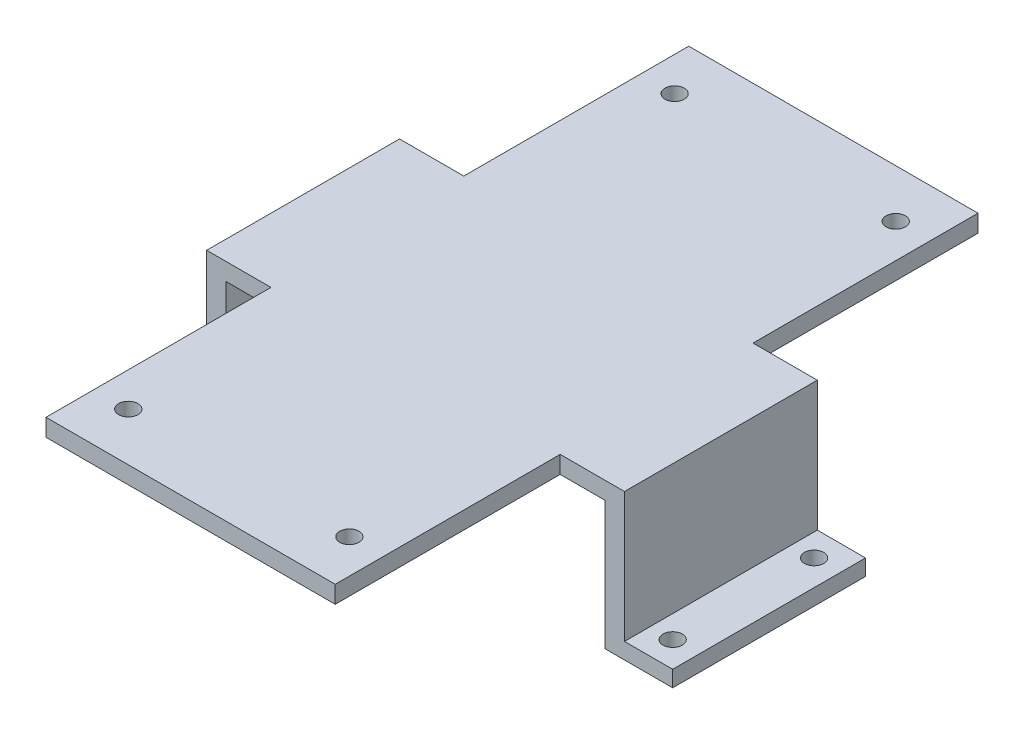
ISO-10303-21;
HEADER;
FILE_DESCRIPTION(('STEP AP214'),'2;1');
FILE_NAME('part.step','',(''),(''),'','','');
FILE_SCHEMA(('AUTOMOTIVE_DESIGN { 1 0 10303 214 1 1 1 1 }'));
ENDSEC;
DATA;
#1=APPLICATION_CONTEXT('core data for automotive mechanical design processes');
#2=APPLICATION_PROTOCOL_DEFINITION('international standard','automotive_design',2000,#1);
#3=PRODUCT_CONTEXT('',#1,'mechanical');
#4=PRODUCT('Part','Part','',(#3));
#5=PRODUCT_RELATED_PRODUCT_CATEGORY('part','',(#4));
#6=PRODUCT_DEFINITION_FORMATION('','',#4);
#7=PRODUCT_DEFINITION_CONTEXT('part definition',#1,'design');
#8=PRODUCT_DEFINITION('design','',#6,#7);
#9=PRODUCT_DEFINITION_SHAPE('','',#8);
#10=(LENGTH_UNIT() NAMED_UNIT(*) SI_UNIT(.MILLI.,.METRE.));
#11=(NAMED_UNIT(*) PLANE_ANGLE_UNIT() SI_UNIT($,.RADIAN.));
#12=(NAMED_UNIT(*) SI_UNIT($,.STERADIAN.) SOLID_ANGLE_UNIT());
#13=UNCERTAINTY_MEASURE_WITH_UNIT(LENGTH_MEASURE(1.E-05),#10,'distance_accuracy_value','');
#14=(GEOMETRIC_REPRESENTATION_CONTEXT(3) GLOBAL_UNCERTAINTY_ASSIGNED_CONTEXT((#13)) GLOBAL_UNIT_ASSIGNED_CONTEXT((#10,
#11,#12)) REPRESENTATION_CONTEXT('',''));
#15=CARTESIAN_POINT('',(0.,0.,0.));
#16=DIRECTION('',(0.,0.,1.));
#17=DIRECTION('',(1.,0.,0.));
#18=AXIS2_PLACEMENT_3D('',#15,#16,#17);
#19=CARTESIAN_POINT('',(-55.,0.,0.));
#20=DIRECTION('',(-1.,0.,0.));
#21=DIRECTION('',(0.,0.,-1.));
#22=AXIS2_PLACEMENT_3D('',#19,#20,#21);
#23=PLANE('',#22);
#24=DIRECTION('',(0.,1.,0.));
#25=VECTOR('',#24,1.);
#26=CARTESIAN_POINT('',(-55.,2.70166894999229,-65.));
#27=LINE('',#26,#25);
#28=CARTESIAN_POINT('',(-55.,-17.5,-65.));
#29=VERTEX_POINT('',#28);
#30=CARTESIAN_POINT('',(-55.,2.70166894999229,-65.));
#31=VERTEX_POINT('',#30);
#32=EDGE_CURVE('E224',#29,#31,#27,.T.);
#33=ORIENTED_EDGE('',*,*,#32,.F.);
#34=DIRECTION('',(0.,0.,1.));
#35=VECTOR('',#34,1.);
#36=CARTESIAN_POINT('',(-55.,-17.5,-65.));
#37=LINE('',#36,#35);
#38=CARTESIAN_POINT('',(-55.,-17.5,-35.));
#39=VERTEX_POINT('',#38);
#40=EDGE_CURVE('E194',#29,#39,#37,.T.);
#41=ORIENTED_EDGE('',*,*,#40,.T.);
#42=DIRECTION('',(0.,-1.,0.));
#43=VECTOR('',#42,1.);
#44=CARTESIAN_POINT('',(-55.,2.70166894999229,-35.));
#45=LINE('',#44,#43);
#46=CARTESIAN_POINT('',(-55.,2.70166894999229,-35.));
#47=VERTEX_POINT('',#46);
#48=EDGE_CURVE('E189',#47,#39,#45,.T.);
#49=ORIENTED_EDGE('',*,*,#48,.F.);
#50=DIRECTION('',(0.,0.,1.));
#51=VECTOR('',#50,1.);
#52=CARTESIAN_POINT('',(-55.,2.70166894999229,-35.));
#53=LINE('',#52,#51);
#54=EDGE_CURVE('E220',#31,#47,#53,.T.);
#55=ORIENTED_EDGE('',*,*,#54,.F.);
#56=EDGE_LOOP('',(#33,#41,#49,#55));
#57=FACE_BOUND('',#56,.T.);
#58=ADVANCED_FACE('F35',(#57),#23,.T.);
#59=CARTESIAN_POINT('',(0.,0.,0.));
#60=DIRECTION('',(0.,1.,0.));
#61=DIRECTION('',(0.,0.,1.));
#62=AXIS2_PLACEMENT_3D('',#59,#60,#61);
#63=PLANE('',#62);
#64=CARTESIAN_POINT('',(-39.7,0.,-7.49999999999999));
#65=DIRECTION('',(0.,1.,0.));
#66=DIRECTION('',(0.,0.,1.));
#67=AXIS2_PLACEMENT_3D('',#64,#65,#66);
#68=CIRCLE('',#67,1.5);
#69=CARTESIAN_POINT('',(-39.7,0.,-5.99999999999999));
#70=VERTEX_POINT('',#69);
#71=EDGE_CURVE('E293',#70,#70,#68,.F.);
#72=ORIENTED_EDGE('',*,*,#71,.F.);
#73=EDGE_LOOP('',(#72));
#74=FACE_BOUND('',#73,.T.);
#75=CARTESIAN_POINT('',(-39.7,0.,-92.5));
#76=DIRECTION('',(0.,1.,0.));
#77=DIRECTION('',(0.,0.,1.));
#78=AXIS2_PLACEMENT_3D('',#75,#76,#77);
#79=CIRCLE('',#78,1.5);
#80=CARTESIAN_POINT('',(-39.7,0.,-91.));
#81=VERTEX_POINT('',#80);
#82=EDGE_CURVE('E302',#81,#81,#79,.F.);
#83=ORIENTED_EDGE('',*,*,#82,.F.);
#84=EDGE_LOOP('',(#83));
#85=FACE_BOUND('',#84,.T.);
#86=CARTESIAN_POINT('',(-5.3,0.,-92.5));
#87=DIRECTION('',(0.,1.,0.));
#88=DIRECTION('',(0.,0.,1.));
#89=AXIS2_PLACEMENT_3D('',#86,#87,#88);
#90=CIRCLE('',#89,1.5);
#91=CARTESIAN_POINT('',(-5.3,0.,-91.));
#92=VERTEX_POINT('',#91);
#93=EDGE_CURVE('E341',#92,#92,#90,.F.);
#94=ORIENTED_EDGE('',*,*,#93,.F.);
#95=EDGE_LOOP('',(#94));
#96=FACE_BOUND('',#95,.T.);
#97=CARTESIAN_POINT('',(-5.3,0.,-7.49999999999998));
#98=DIRECTION('',(0.,1.,0.));
#99=DIRECTION('',(0.,0.,1.));
#100=AXIS2_PLACEMENT_3D('',#97,#98,#99);
#101=CIRCLE('',#100,1.5);
#102=CARTESIAN_POINT('',(-5.3,0.,-5.99999999999998));
#103=VERTEX_POINT('',#102);
#104=EDGE_CURVE('E43',#103,#103,#101,.F.);
#105=ORIENTED_EDGE('',*,*,#104,.F.);
#106=EDGE_LOOP('',(#105));
#107=FACE_BOUND('',#106,.T.);
#108=DIRECTION('',(0.,0.,1.));
#109=VECTOR('',#108,1.);
#110=CARTESIAN_POINT('',(-52.,0.,-35.));
#111=LINE('',#110,#109);
#112=CARTESIAN_POINT('',(-52.,0.,-65.));
#113=VERTEX_POINT('',#112);
#114=CARTESIAN_POINT('',(-52.,0.,-35.));
#115=VERTEX_POINT('',#114);
#116=EDGE_CURVE('E203',#113,#115,#111,.T.);
#117=ORIENTED_EDGE('',*,*,#116,.F.);
#118=DIRECTION('',(1.,0.,0.));
#119=VECTOR('',#118,1.);
#120=CARTESIAN_POINT('',(-55.,0.,-65.));
#121=LINE('',#120,#119);
#122=CARTESIAN_POINT('',(-45.,0.,-65.));
#123=VERTEX_POINT('',#122);
#124=EDGE_CURVE('E231',#113,#123,#121,.T.);
#125=ORIENTED_EDGE('',*,*,#124,.T.);
#126=DIRECTION('',(0.,0.,1.));
#127=VECTOR('',#126,1.);
#128=CARTESIAN_POINT('',(-45.,0.,0.));
#129=LINE('',#128,#127);
#130=CARTESIAN_POINT('',(-45.,0.,-100.));
#131=VERTEX_POINT('',#130);
#132=EDGE_CURVE('E325',#131,#123,#129,.T.);
#133=ORIENTED_EDGE('',*,*,#132,.F.);
#134=DIRECTION('',(-1.,0.,0.));
#135=VECTOR('',#134,1.);
#136=CARTESIAN_POINT('',(0.,0.,-100.));
#137=LINE('',#136,#135);
#138=CARTESIAN_POINT('',(0.,0.,-100.));
#139=VERTEX_POINT('',#138);
#140=EDGE_CURVE('E322',#139,#131,#137,.T.);
#141=ORIENTED_EDGE('',*,*,#140,.F.);
#142=DIRECTION('',(0.,0.,-1.));
#143=VECTOR('',#142,1.);
#144=CARTESIAN_POINT('',(0.,0.,0.));
#145=LINE('',#144,#143);
#146=CARTESIAN_POINT('',(0.,0.,-65.));
#147=VERTEX_POINT('',#146);
#148=EDGE_CURVE('E305',#147,#139,#145,.T.);
#149=ORIENTED_EDGE('',*,*,#148,.F.);
#150=DIRECTION('',(-1.,0.,0.));
#151=VECTOR('',#150,1.);
#152=CARTESIAN_POINT('',(10.,0.,-65.));
#153=LINE('',#152,#151);
#154=CARTESIAN_POINT('',(7.,0.,-65.));
#155=VERTEX_POINT('',#154);
#156=EDGE_CURVE('E289',#155,#147,#153,.T.);
#157=ORIENTED_EDGE('',*,*,#156,.F.);
#158=DIRECTION('',(0.,0.,-1.));
#159=VECTOR('',#158,1.);
#160=CARTESIAN_POINT('',(7.,0.,-35.));
#161=LINE('',#160,#159);
#162=CARTESIAN_POINT('',(7.,0.,-35.));
#163=VERTEX_POINT('',#162);
#164=EDGE_CURVE('E256',#163,#155,#161,.T.);
#165=ORIENTED_EDGE('',*,*,#164,.F.);
#166=DIRECTION('',(-1.,0.,0.));
#167=VECTOR('',#166,1.);
#168=CARTESIAN_POINT('',(10.,0.,-35.));
#169=LINE('',#168,#167);
#170=CARTESIAN_POINT('',(0.,0.,-35.));
#171=VERTEX_POINT('',#170);
#172=EDGE_CURVE('E291',#163,#171,#169,.T.);
#173=ORIENTED_EDGE('',*,*,#172,.T.);
#174=CARTESIAN_POINT('',(0.,0.,0.));
#175=VERTEX_POINT('',#174);
#176=EDGE_CURVE('E319',#175,#171,#145,.T.);
#177=ORIENTED_EDGE('',*,*,#176,.F.);
#178=DIRECTION('',(1.,0.,0.));
#179=VECTOR('',#178,1.);
#180=CARTESIAN_POINT('',(0.,0.,0.));
#181=LINE('',#180,#179);
#182=CARTESIAN_POINT('',(-45.,0.,0.));
#183=VERTEX_POINT('',#182);
#184=EDGE_CURVE('E328',#183,#175,#181,.T.);
#185=ORIENTED_EDGE('',*,*,#184,.F.);
#186=CARTESIAN_POINT('',(-45.,0.,-35.));
#187=VERTEX_POINT('',#186);
#188=EDGE_CURVE('E324',#187,#183,#129,.T.);
#189=ORIENTED_EDGE('',*,*,#188,.F.);
#190=DIRECTION('',(1.,0.,0.));
#191=VECTOR('',#190,1.);
#192=CARTESIAN_POINT('',(-55.,0.,-35.));
#193=LINE('',#192,#191);
#194=EDGE_CURVE('E58',#115,#187,#193,.T.);
#195=ORIENTED_EDGE('',*,*,#194,.F.);
#196=EDGE_LOOP('',(#117,#125,#133,#141,#149,#157,#165,#173,#177,#185,#189,#195));
#197=FACE_BOUND('',#196,.T.);
#198=ADVANCED_FACE('F351',(#74,#85,#96,#107,#197),#63,.F.);
#199=CARTESIAN_POINT('',(-45.,2.70166894999229,0.));
#200=DIRECTION('',(1.,0.,0.));
#201=DIRECTION('',(0.,0.,-1.));
#202=AXIS2_PLACEMENT_3D('',#199,#200,#201);
#203=PLANE('',#202);
#204=DIRECTION('',(0.,0.,1.));
#205=VECTOR('',#204,1.);
#206=CARTESIAN_POINT('',(-45.,2.70166894999229,0.));
#207=LINE('',#206,#205);
#208=CARTESIAN_POINT('',(-45.,2.70166894999229,-35.));
#209=VERTEX_POINT('',#208);
#210=CARTESIAN_POINT('',(-45.,2.70166894999229,0.));
#211=VERTEX_POINT('',#210);
#212=EDGE_CURVE('E312',#209,#211,#207,.T.);
#213=ORIENTED_EDGE('',*,*,#212,.F.);
#214=DIRECTION('',(0.,-1.,0.));
#215=VECTOR('',#214,1.);
#216=CARTESIAN_POINT('',(-45.,2.70166894999229,-35.));
#217=LINE('',#216,#215);
#218=EDGE_CURVE('E218',#209,#187,#217,.T.);
#219=ORIENTED_EDGE('',*,*,#218,.T.);
#220=ORIENTED_EDGE('',*,*,#188,.T.);
#221=DIRECTION('',(0.,-1.,0.));
#222=VECTOR('',#221,1.);
#223=CARTESIAN_POINT('',(-45.,2.70166894999229,0.));
#224=LINE('',#223,#222);
#225=EDGE_CURVE('E332',#211,#183,#224,.T.);
#226=ORIENTED_EDGE('',*,*,#225,.F.);
#227=EDGE_LOOP('',(#213,#219,#220,#226));
#228=FACE_BOUND('',#227,.T.);
#229=ADVANCED_FACE('F353',(#228),#203,.F.);
#230=CARTESIAN_POINT('',(0.,2.70166894999229,0.));
#231=DIRECTION('',(-1.,0.,0.));
#232=DIRECTION('',(0.,0.,1.));
#233=AXIS2_PLACEMENT_3D('',#230,#231,#232);
#234=PLANE('',#233);
#235=DIRECTION('',(0.,-1.,0.));
#236=VECTOR('',#235,1.);
#237=CARTESIAN_POINT('',(0.,2.70166894999229,-35.));
#238=LINE('',#237,#236);
#239=CARTESIAN_POINT('',(0.,2.70166894999229,-35.));
#240=VERTEX_POINT('',#239);
#241=EDGE_CURVE('E271',#240,#171,#238,.T.);
#242=ORIENTED_EDGE('',*,*,#241,.F.);
#243=DIRECTION('',(0.,0.,-1.));
#244=VECTOR('',#243,1.);
#245=CARTESIAN_POINT('',(0.,2.70166894999229,0.));
#246=LINE('',#245,#244);
#247=CARTESIAN_POINT('',(0.,2.70166894999229,0.));
#248=VERTEX_POINT('',#247);
#249=EDGE_CURVE('E306',#248,#240,#246,.T.);
#250=ORIENTED_EDGE('',*,*,#249,.F.);
#251=DIRECTION('',(0.,-1.,0.));
#252=VECTOR('',#251,1.);
#253=CARTESIAN_POINT('',(0.,2.70166894999229,0.));
#254=LINE('',#253,#252);
#255=EDGE_CURVE('E318',#248,#175,#254,.T.);
#256=ORIENTED_EDGE('',*,*,#255,.T.);
#257=ORIENTED_EDGE('',*,*,#176,.T.);
#258=EDGE_LOOP('',(#242,#250,#256,#257));
#259=FACE_BOUND('',#258,.T.);
#260=ADVANCED_FACE('F421',(#259),#234,.F.);
#261=DIRECTION('',(0.,1.,0.));
#262=VECTOR('',#261,1.);
#263=CARTESIAN_POINT('',(0.,2.70166894999229,-65.));
#264=LINE('',#263,#262);
#265=CARTESIAN_POINT('',(0.,2.70166894999229,-65.));
#266=VERTEX_POINT('',#265);
#267=EDGE_CURVE('E275',#147,#266,#264,.T.);
#268=ORIENTED_EDGE('',*,*,#267,.F.);
#269=ORIENTED_EDGE('',*,*,#148,.T.);
#270=DIRECTION('',(0.,-1.,0.));
#271=VECTOR('',#270,1.);
#272=CARTESIAN_POINT('',(0.,2.70166894999229,-100.));
#273=LINE('',#272,#271);
#274=CARTESIAN_POINT('',(0.,2.70166894999229,-100.));
#275=VERTEX_POINT('',#274);
#276=EDGE_CURVE('E338',#275,#139,#273,.T.);
#277=ORIENTED_EDGE('',*,*,#276,.F.);
#278=EDGE_CURVE('E310',#266,#275,#246,.T.);
#279=ORIENTED_EDGE('',*,*,#278,.F.);
#280=EDGE_LOOP('',(#268,#269,#277,#279));
#281=FACE_BOUND('',#280,.T.);
#282=ADVANCED_FACE('F387',(#281),#234,.F.);
#283=CARTESIAN_POINT('',(-5.3,-4.24264068711929,-7.49999999999998));
#284=DIRECTION('',(0.,1.,0.));
#285=DIRECTION('',(0.,0.,1.));
#286=AXIS2_PLACEMENT_3D('',#283,#284,#285);
#287=CYLINDRICAL_SURFACE('',#286,1.5);
#288=ORIENTED_EDGE('',*,*,#104,.T.);
#289=EDGE_LOOP('',(#288));
#290=FACE_BOUND('',#289,.T.);
#291=CARTESIAN_POINT('',(-5.3,2.70166894999229,-7.49999999999998));
#292=DIRECTION('',(0.,1.,0.));
#293=DIRECTION('',(0.,0.,1.));
#294=AXIS2_PLACEMENT_3D('',#291,#292,#293);
#295=CIRCLE('',#294,1.5);
#296=CARTESIAN_POINT('',(-5.3,2.70166894999229,-5.99999999999998));
#297=VERTEX_POINT('',#296);
#298=EDGE_CURVE('E11',#297,#297,#295,.T.);
#299=ORIENTED_EDGE('',*,*,#298,.T.);
#300=EDGE_LOOP('',(#299));
#301=FACE_BOUND('',#300,.T.);
#302=ADVANCED_FACE('F37',(#290,#301),#287,.F.);
#303=CARTESIAN_POINT('',(-5.3,-4.24264068711929,-92.5));
#304=DIRECTION('',(0.,1.,0.));
#305=DIRECTION('',(0.,0.,1.));
#306=AXIS2_PLACEMENT_3D('',#303,#304,#305);
#307=CYLINDRICAL_SURFACE('',#306,1.5);
#308=ORIENTED_EDGE('',*,*,#93,.T.);
#309=EDGE_LOOP('',(#308));
#310=FACE_BOUND('',#309,.T.);
#311=CARTESIAN_POINT('',(-5.3,2.70166894999229,-92.5));
#312=DIRECTION('',(0.,1.,0.));
#313=DIRECTION('',(0.,0.,1.));
#314=AXIS2_PLACEMENT_3D('',#311,#312,#313);
#315=CIRCLE('',#314,1.5);
#316=CARTESIAN_POINT('',(-5.3,2.70166894999229,-91.));
#317=VERTEX_POINT('',#316);
#318=EDGE_CURVE('E344',#317,#317,#315,.T.);
#319=ORIENTED_EDGE('',*,*,#318,.T.);
#320=EDGE_LOOP('',(#319));
#321=FACE_BOUND('',#320,.T.);
#322=ADVANCED_FACE('F707',(#310,#321),#307,.F.);
#323=CARTESIAN_POINT('',(0.,2.70166894999229,-100.));
#324=DIRECTION('',(0.,0.,1.));
#325=DIRECTION('',(1.,0.,0.));
#326=AXIS2_PLACEMENT_3D('',#323,#324,#325);
#327=PLANE('',#326);
#328=ORIENTED_EDGE('',*,*,#140,.T.);
#329=DIRECTION('',(0.,-1.,0.));
#330=VECTOR('',#329,1.);
#331=CARTESIAN_POINT('',(-45.,2.70166894999229,-100.));
#332=LINE('',#331,#330);
#333=CARTESIAN_POINT('',(-45.,2.70166894999229,-100.));
#334=VERTEX_POINT('',#333);
#335=EDGE_CURVE('E335',#334,#131,#332,.T.);
#336=ORIENTED_EDGE('',*,*,#335,.F.);
#337=DIRECTION('',(-1.,0.,0.));
#338=VECTOR('',#337,1.);
#339=CARTESIAN_POINT('',(0.,2.70166894999229,-100.));
#340=LINE('',#339,#338);
#341=EDGE_CURVE('E309',#275,#334,#340,.T.);
#342=ORIENTED_EDGE('',*,*,#341,.F.);
#343=ORIENTED_EDGE('',*,*,#276,.T.);
#344=EDGE_LOOP('',(#328,#336,#342,#343));
#345=FACE_BOUND('',#344,.T.);
#346=ADVANCED_FACE('F384',(#345),#327,.F.);
#347=ORIENTED_EDGE('',*,*,#132,.T.);
#348=DIRECTION('',(0.,1.,0.));
#349=VECTOR('',#348,1.);
#350=CARTESIAN_POINT('',(-45.,2.70166894999229,-65.));
#351=LINE('',#350,#349);
#352=CARTESIAN_POINT('',(-45.,2.70166894999229,-65.));
#353=VERTEX_POINT('',#352);
#354=EDGE_CURVE('E221',#123,#353,#351,.T.);
#355=ORIENTED_EDGE('',*,*,#354,.T.);
#356=EDGE_CURVE('E313',#334,#353,#207,.T.);
#357=ORIENTED_EDGE('',*,*,#356,.F.);
#358=ORIENTED_EDGE('',*,*,#335,.T.);
#359=EDGE_LOOP('',(#347,#355,#357,#358));
#360=FACE_BOUND('',#359,.T.);
#361=ADVANCED_FACE('F377',(#360),#203,.F.);
#362=CARTESIAN_POINT('',(0.,2.70166894999229,0.));
#363=DIRECTION('',(0.,0.,-1.));
#364=DIRECTION('',(-1.,0.,0.));
#365=AXIS2_PLACEMENT_3D('',#362,#363,#364);
#366=PLANE('',#365);
#367=ORIENTED_EDGE('',*,*,#184,.T.);
#368=ORIENTED_EDGE('',*,*,#255,.F.);
#369=DIRECTION('',(1.,0.,0.));
#370=VECTOR('',#369,1.);
#371=CARTESIAN_POINT('',(0.,2.70166894999229,0.));
#372=LINE('',#371,#370);
#373=EDGE_CURVE('E316',#211,#248,#372,.T.);
#374=ORIENTED_EDGE('',*,*,#373,.F.);
#375=ORIENTED_EDGE('',*,*,#225,.T.);
#376=EDGE_LOOP('',(#367,#368,#374,#375));
#377=FACE_BOUND('',#376,.T.);
#378=ADVANCED_FACE('F427',(#377),#366,.F.);
#379=CARTESIAN_POINT('',(0.,2.70166894999229,0.));
#380=DIRECTION('',(0.,1.,0.));
#381=DIRECTION('',(0.,0.,1.));
#382=AXIS2_PLACEMENT_3D('',#379,#380,#381);
#383=PLANE('',#382);
#384=CARTESIAN_POINT('',(-39.7,2.70166894999229,-7.49999999999999));
#385=DIRECTION('',(0.,1.,0.));
#386=DIRECTION('',(0.,0.,1.));
#387=AXIS2_PLACEMENT_3D('',#384,#385,#386);
#388=CIRCLE('',#387,1.5);
#389=CARTESIAN_POINT('',(-39.7,2.70166894999229,-5.99999999999999));
#390=VERTEX_POINT('',#389);
#391=EDGE_CURVE('E296',#390,#390,#388,.T.);
#392=ORIENTED_EDGE('',*,*,#391,.F.);
#393=EDGE_LOOP('',(#392));
#394=FACE_BOUND('',#393,.T.);
#395=CARTESIAN_POINT('',(-39.7,2.70166894999229,-92.5));
#396=DIRECTION('',(0.,1.,0.));
#397=DIRECTION('',(0.,0.,1.));
#398=AXIS2_PLACEMENT_3D('',#395,#396,#397);
#399=CIRCLE('',#398,1.5);
#400=CARTESIAN_POINT('',(-39.7,2.70166894999229,-91.));
#401=VERTEX_POINT('',#400);
#402=EDGE_CURVE('E299',#401,#401,#399,.T.);
#403=ORIENTED_EDGE('',*,*,#402,.F.);
#404=EDGE_LOOP('',(#403));
#405=FACE_BOUND('',#404,.T.);
#406=ORIENTED_EDGE('',*,*,#249,.T.);
#407=DIRECTION('',(-1.,0.,0.));
#408=VECTOR('',#407,1.);
#409=CARTESIAN_POINT('',(10.,2.70166894999229,-35.));
#410=LINE('',#409,#408);
#411=CARTESIAN_POINT('',(10.,2.70166894999229,-35.));
#412=VERTEX_POINT('',#411);
#413=EDGE_CURVE('E279',#412,#240,#410,.T.);
#414=ORIENTED_EDGE('',*,*,#413,.F.);
#415=DIRECTION('',(0.,0.,1.));
#416=VECTOR('',#415,1.);
#417=CARTESIAN_POINT('',(10.,2.70166894999229,-35.));
#418=LINE('',#417,#416);
#419=CARTESIAN_POINT('',(10.,2.70166894999229,-65.));
#420=VERTEX_POINT('',#419);
#421=EDGE_CURVE('E277',#420,#412,#418,.T.);
#422=ORIENTED_EDGE('',*,*,#421,.F.);
#423=DIRECTION('',(-1.,0.,0.));
#424=VECTOR('',#423,1.);
#425=CARTESIAN_POINT('',(10.,2.70166894999229,-65.));
#426=LINE('',#425,#424);
#427=EDGE_CURVE('E286',#420,#266,#426,.T.);
#428=ORIENTED_EDGE('',*,*,#427,.T.);
#429=ORIENTED_EDGE('',*,*,#278,.T.);
#430=ORIENTED_EDGE('',*,*,#341,.T.);
#431=ORIENTED_EDGE('',*,*,#356,.T.);
#432=DIRECTION('',(1.,0.,0.));
#433=VECTOR('',#432,1.);
#434=CARTESIAN_POINT('',(-55.,2.70166894999229,-65.));
#435=LINE('',#434,#433);
#436=EDGE_CURVE('E233',#31,#353,#435,.T.);
#437=ORIENTED_EDGE('',*,*,#436,.F.);
#438=ORIENTED_EDGE('',*,*,#54,.T.);
#439=DIRECTION('',(1.,0.,0.));
#440=VECTOR('',#439,1.);
#441=CARTESIAN_POINT('',(-55.,2.70166894999229,-35.));
#442=LINE('',#441,#440);
#443=EDGE_CURVE('E235',#47,#209,#442,.T.);
#444=ORIENTED_EDGE('',*,*,#443,.T.);
#445=ORIENTED_EDGE('',*,*,#212,.T.);
#446=ORIENTED_EDGE('',*,*,#373,.T.);
#447=EDGE_LOOP('',(#406,#414,#422,#428,#429,#430,#431,#437,#438,#444,#445,#446));
#448=FACE_BOUND('',#447,.T.);
#449=ORIENTED_EDGE('',*,*,#318,.F.);
#450=EDGE_LOOP('',(#449));
#451=FACE_BOUND('',#450,.T.);
#452=ORIENTED_EDGE('',*,*,#298,.F.);
#453=EDGE_LOOP('',(#452));
#454=FACE_BOUND('',#453,.T.);
#455=ADVANCED_FACE('F373',(#394,#405,#448,#451,#454),#383,.T.);
#456=CARTESIAN_POINT('',(-39.7,-4.24264068711929,-92.5));
#457=DIRECTION('',(0.,1.,0.));
#458=DIRECTION('',(0.,0.,1.));
#459=AXIS2_PLACEMENT_3D('',#456,#457,#458);
#460=CYLINDRICAL_SURFACE('',#459,1.5);
#461=ORIENTED_EDGE('',*,*,#82,.T.);
#462=EDGE_LOOP('',(#461));
#463=FACE_BOUND('',#462,.T.);
#464=ORIENTED_EDGE('',*,*,#402,.T.);
#465=EDGE_LOOP('',(#464));
#466=FACE_BOUND('',#465,.T.);
#467=ADVANCED_FACE('F469',(#463,#466),#460,.F.);
#468=CARTESIAN_POINT('',(-39.7,-4.24264068711929,-7.49999999999999));
#469=DIRECTION('',(0.,1.,0.));
#470=DIRECTION('',(0.,0.,1.));
#471=AXIS2_PLACEMENT_3D('',#468,#469,#470);
#472=CYLINDRICAL_SURFACE('',#471,1.5);
#473=ORIENTED_EDGE('',*,*,#71,.T.);
#474=EDGE_LOOP('',(#473));
#475=FACE_BOUND('',#474,.T.);
#476=ORIENTED_EDGE('',*,*,#391,.T.);
#477=EDGE_LOOP('',(#476));
#478=FACE_BOUND('',#477,.T.);
#479=ADVANCED_FACE('F466',(#475,#478),#472,.F.);
#480=CARTESIAN_POINT('',(10.,2.70166894999229,-35.));
#481=DIRECTION('',(0.,0.,-1.));
#482=DIRECTION('',(-1.,0.,0.));
#483=AXIS2_PLACEMENT_3D('',#480,#481,#482);
#484=PLANE('',#483);
#485=ORIENTED_EDGE('',*,*,#241,.T.);
#486=ORIENTED_EDGE('',*,*,#172,.F.);
#487=DIRECTION('',(0.,1.,0.));
#488=VECTOR('',#487,1.);
#489=CARTESIAN_POINT('',(7.,-20.,-35.));
#490=LINE('',#489,#488);
#491=CARTESIAN_POINT('',(7.,-20.,-35.));
#492=VERTEX_POINT('',#491);
#493=EDGE_CURVE('E268',#492,#163,#490,.T.);
#494=ORIENTED_EDGE('',*,*,#493,.F.);
#495=DIRECTION('',(-1.,0.,0.));
#496=VECTOR('',#495,1.);
#497=CARTESIAN_POINT('',(10.,-20.,-35.));
#498=LINE('',#497,#496);
#499=CARTESIAN_POINT('',(17.5,-20.,-35.));
#500=VERTEX_POINT('',#499);
#501=EDGE_CURVE('E257',#500,#492,#498,.T.);
#502=ORIENTED_EDGE('',*,*,#501,.F.);
#503=DIRECTION('',(0.,-1.,0.));
#504=VECTOR('',#503,1.);
#505=CARTESIAN_POINT('',(17.5,-20.,-35.));
#506=LINE('',#505,#504);
#507=CARTESIAN_POINT('',(17.5,-17.5,-35.));
#508=VERTEX_POINT('',#507);
#509=EDGE_CURVE('E238',#508,#500,#506,.T.);
#510=ORIENTED_EDGE('',*,*,#509,.F.);
#511=DIRECTION('',(-1.,0.,0.));
#512=VECTOR('',#511,1.);
#513=CARTESIAN_POINT('',(17.5,-17.5,-35.));
#514=LINE('',#513,#512);
#515=CARTESIAN_POINT('',(10.,-17.5,-35.));
#516=VERTEX_POINT('',#515);
#517=EDGE_CURVE('E248',#508,#516,#514,.T.);
#518=ORIENTED_EDGE('',*,*,#517,.T.);
#519=DIRECTION('',(0.,-1.,0.));
#520=VECTOR('',#519,1.);
#521=CARTESIAN_POINT('',(10.,2.70166894999229,-35.));
#522=LINE('',#521,#520);
#523=EDGE_CURVE('E272',#412,#516,#522,.T.);
#524=ORIENTED_EDGE('',*,*,#523,.F.);
#525=ORIENTED_EDGE('',*,*,#413,.T.);
#526=EDGE_LOOP('',(#485,#486,#494,#502,#510,#518,#524,#525));
#527=FACE_BOUND('',#526,.T.);
#528=ADVANCED_FACE('F418',(#527),#484,.F.);
#529=CARTESIAN_POINT('',(10.,2.70166894999229,-65.));
#530=DIRECTION('',(0.,0.,1.));
#531=DIRECTION('',(1.,0.,0.));
#532=AXIS2_PLACEMENT_3D('',#529,#530,#531);
#533=PLANE('',#532);
#534=ORIENTED_EDGE('',*,*,#267,.T.);
#535=ORIENTED_EDGE('',*,*,#427,.F.);
#536=DIRECTION('',(0.,1.,0.));
#537=VECTOR('',#536,1.);
#538=CARTESIAN_POINT('',(10.,2.70166894999229,-65.));
#539=LINE('',#538,#537);
#540=CARTESIAN_POINT('',(10.,-17.5,-65.));
#541=VERTEX_POINT('',#540);
#542=EDGE_CURVE('E274',#541,#420,#539,.T.);
#543=ORIENTED_EDGE('',*,*,#542,.F.);
#544=DIRECTION('',(-1.,0.,0.));
#545=VECTOR('',#544,1.);
#546=CARTESIAN_POINT('',(17.5,-17.5,-65.));
#547=LINE('',#546,#545);
#548=CARTESIAN_POINT('',(17.5,-17.5,-65.));
#549=VERTEX_POINT('',#548);
#550=EDGE_CURVE('E253',#549,#541,#547,.T.);
#551=ORIENTED_EDGE('',*,*,#550,.F.);
#552=DIRECTION('',(0.,1.,0.));
#553=VECTOR('',#552,1.);
#554=CARTESIAN_POINT('',(17.5,-20.,-65.));
#555=LINE('',#554,#553);
#556=CARTESIAN_POINT('',(17.5,-20.,-65.));
#557=VERTEX_POINT('',#556);
#558=EDGE_CURVE('E244',#557,#549,#555,.T.);
#559=ORIENTED_EDGE('',*,*,#558,.F.);
#560=DIRECTION('',(1.,0.,0.));
#561=VECTOR('',#560,1.);
#562=CARTESIAN_POINT('',(10.,-20.,-65.));
#563=LINE('',#562,#561);
#564=CARTESIAN_POINT('',(7.,-20.,-65.));
#565=VERTEX_POINT('',#564);
#566=EDGE_CURVE('E261',#565,#557,#563,.T.);
#567=ORIENTED_EDGE('',*,*,#566,.F.);
#568=DIRECTION('',(0.,1.,0.));
#569=VECTOR('',#568,1.);
#570=CARTESIAN_POINT('',(7.,-20.,-65.));
#571=LINE('',#570,#569);
#572=EDGE_CURVE('E263',#565,#155,#571,.T.);
#573=ORIENTED_EDGE('',*,*,#572,.T.);
#574=ORIENTED_EDGE('',*,*,#156,.T.);
#575=EDGE_LOOP('',(#534,#535,#543,#551,#559,#567,#573,#574));
#576=FACE_BOUND('',#575,.T.);
#577=ADVANCED_FACE('F390',(#576),#533,.F.);
#578=CARTESIAN_POINT('',(10.,0.,0.));
#579=DIRECTION('',(1.,0.,0.));
#580=DIRECTION('',(0.,0.,-1.));
#581=AXIS2_PLACEMENT_3D('',#578,#579,#580);
#582=PLANE('',#581);
#583=DIRECTION('',(0.,0.,1.));
#584=VECTOR('',#583,1.);
#585=CARTESIAN_POINT('',(10.,-17.5,-35.));
#586=LINE('',#585,#584);
#587=EDGE_CURVE('E237',#541,#516,#586,.T.);
#588=ORIENTED_EDGE('',*,*,#587,.F.);
#589=ORIENTED_EDGE('',*,*,#542,.T.);
#590=ORIENTED_EDGE('',*,*,#421,.T.);
#591=ORIENTED_EDGE('',*,*,#523,.T.);
#592=EDGE_LOOP('',(#588,#589,#590,#591));
#593=FACE_BOUND('',#592,.T.);
#594=ADVANCED_FACE('F396',(#593),#582,.T.);
#595=CARTESIAN_POINT('',(7.,-20.,-35.));
#596=DIRECTION('',(1.,0.,0.));
#597=DIRECTION('',(0.,0.,-1.));
#598=AXIS2_PLACEMENT_3D('',#595,#596,#597);
#599=PLANE('',#598);
#600=ORIENTED_EDGE('',*,*,#164,.T.);
#601=ORIENTED_EDGE('',*,*,#572,.F.);
#602=DIRECTION('',(0.,0.,-1.));
#603=VECTOR('',#602,1.);
#604=CARTESIAN_POINT('',(7.,-20.,-35.));
#605=LINE('',#604,#603);
#606=EDGE_CURVE('E259',#492,#565,#605,.T.);
#607=ORIENTED_EDGE('',*,*,#606,.F.);
#608=ORIENTED_EDGE('',*,*,#493,.T.);
#609=EDGE_LOOP('',(#600,#601,#607,#608));
#610=FACE_BOUND('',#609,.T.);
#611=ADVANCED_FACE('F414',(#610),#599,.F.);
#612=CARTESIAN_POINT('',(0.,-20.,0.));
#613=DIRECTION('',(0.,1.,0.));
#614=DIRECTION('',(0.,0.,1.));
#615=AXIS2_PLACEMENT_3D('',#612,#613,#614);
#616=PLANE('',#615);
#617=CARTESIAN_POINT('',(13.5,-20.,-61.));
#618=DIRECTION('',(0.,-1.,0.));
#619=DIRECTION('',(0.,0.,-1.));
#620=AXIS2_PLACEMENT_3D('',#617,#618,#619);
#621=CIRCLE('',#620,1.5);
#622=CARTESIAN_POINT('',(13.5,-20.,-62.5));
#623=VERTEX_POINT('',#622);
#624=EDGE_CURVE('E744',#623,#623,#621,.F.);
#625=ORIENTED_EDGE('',*,*,#624,.T.);
#626=EDGE_LOOP('',(#625));
#627=FACE_BOUND('',#626,.T.);
#628=CARTESIAN_POINT('',(13.5,-20.,-39.));
#629=DIRECTION('',(0.,-1.,0.));
#630=DIRECTION('',(0.,0.,-1.));
#631=AXIS2_PLACEMENT_3D('',#628,#629,#630);
#632=CIRCLE('',#631,1.5);
#633=CARTESIAN_POINT('',(13.5,-20.,-40.5));
#634=VERTEX_POINT('',#633);
#635=EDGE_CURVE('E754',#634,#634,#632,.F.);
#636=ORIENTED_EDGE('',*,*,#635,.T.);
#637=EDGE_LOOP('',(#636));
#638=FACE_BOUND('',#637,.T.);
#639=ORIENTED_EDGE('',*,*,#566,.T.);
#640=DIRECTION('',(0.,0.,-1.));
#641=VECTOR('',#640,1.);
#642=CARTESIAN_POINT('',(17.5,-20.,-35.));
#643=LINE('',#642,#641);
#644=EDGE_CURVE('E241',#500,#557,#643,.T.);
#645=ORIENTED_EDGE('',*,*,#644,.F.);
#646=ORIENTED_EDGE('',*,*,#501,.T.);
#647=ORIENTED_EDGE('',*,*,#606,.T.);
#648=EDGE_LOOP('',(#639,#645,#646,#647));
#649=FACE_BOUND('',#648,.T.);
#650=ADVANCED_FACE('F410',(#627,#638,#649),#616,.F.);
#651=CARTESIAN_POINT('',(17.5,-17.5,-35.));
#652=DIRECTION('',(0.,-1.,0.));
#653=DIRECTION('',(0.,0.,-1.));
#654=AXIS2_PLACEMENT_3D('',#651,#652,#653);
#655=PLANE('',#654);
#656=CARTESIAN_POINT('',(13.5,-17.5,-61.));
#657=DIRECTION('',(0.,1.,0.));
#658=DIRECTION('',(0.,0.,1.));
#659=AXIS2_PLACEMENT_3D('',#656,#657,#658);
#660=CIRCLE('',#659,1.5);
#661=CARTESIAN_POINT('',(13.5,-17.5,-59.5));
#662=VERTEX_POINT('',#661);
#663=EDGE_CURVE('E741',#662,#662,#660,.T.);
#664=ORIENTED_EDGE('',*,*,#663,.F.);
#665=EDGE_LOOP('',(#664));
#666=FACE_BOUND('',#665,.T.);
#667=CARTESIAN_POINT('',(13.5,-17.5,-39.));
#668=DIRECTION('',(0.,1.,0.));
#669=DIRECTION('',(0.,0.,1.));
#670=AXIS2_PLACEMENT_3D('',#667,#668,#669);
#671=CIRCLE('',#670,1.5);
#672=CARTESIAN_POINT('',(13.5,-17.5,-37.5));
#673=VERTEX_POINT('',#672);
#674=EDGE_CURVE('E757',#673,#673,#671,.T.);
#675=ORIENTED_EDGE('',*,*,#674,.F.);
#676=EDGE_LOOP('',(#675));
#677=FACE_BOUND('',#676,.T.);
#678=ORIENTED_EDGE('',*,*,#587,.T.);
#679=ORIENTED_EDGE('',*,*,#517,.F.);
#680=DIRECTION('',(0.,0.,1.));
#681=VECTOR('',#680,1.);
#682=CARTESIAN_POINT('',(17.5,-17.5,-35.));
#683=LINE('',#682,#681);
#684=EDGE_CURVE('E246',#549,#508,#683,.T.);
#685=ORIENTED_EDGE('',*,*,#684,.F.);
#686=ORIENTED_EDGE('',*,*,#550,.T.);
#687=EDGE_LOOP('',(#678,#679,#685,#686));
#688=FACE_BOUND('',#687,.T.);
#689=ADVANCED_FACE('F401',(#666,#677,#688),#655,.F.);
#690=CARTESIAN_POINT('',(17.5,0.,0.));
#691=DIRECTION('',(-1.,0.,0.));
#692=DIRECTION('',(0.,0.,1.));
#693=AXIS2_PLACEMENT_3D('',#690,#691,#692);
#694=PLANE('',#693);
#695=ORIENTED_EDGE('',*,*,#509,.T.);
#696=ORIENTED_EDGE('',*,*,#644,.T.);
#697=ORIENTED_EDGE('',*,*,#558,.T.);
#698=ORIENTED_EDGE('',*,*,#684,.T.);
#699=EDGE_LOOP('',(#695,#696,#697,#698));
#700=FACE_BOUND('',#699,.T.);
#701=ADVANCED_FACE('F405',(#700),#694,.F.);
#702=CARTESIAN_POINT('',(-55.,2.70166894999229,-35.));
#703=DIRECTION('',(0.,0.,1.));
#704=DIRECTION('',(1.,0.,0.));
#705=AXIS2_PLACEMENT_3D('',#702,#703,#704);
#706=PLANE('',#705);
#707=ORIENTED_EDGE('',*,*,#218,.F.);
#708=ORIENTED_EDGE('',*,*,#443,.F.);
#709=ORIENTED_EDGE('',*,*,#48,.T.);
#710=DIRECTION('',(1.,0.,0.));
#711=VECTOR('',#710,1.);
#712=CARTESIAN_POINT('',(-62.5,-17.5,-35.));
#713=LINE('',#712,#711);
#714=CARTESIAN_POINT('',(-62.5,-17.5,-35.));
#715=VERTEX_POINT('',#714);
#716=EDGE_CURVE('E50',#715,#39,#713,.T.);
#717=ORIENTED_EDGE('',*,*,#716,.F.);
#718=DIRECTION('',(0.,1.,0.));
#719=VECTOR('',#718,1.);
#720=CARTESIAN_POINT('',(-62.5,-20.,-35.));
#721=LINE('',#720,#719);
#722=CARTESIAN_POINT('',(-62.5,-20.,-35.));
#723=VERTEX_POINT('',#722);
#724=EDGE_CURVE('E175',#723,#715,#721,.T.);
#725=ORIENTED_EDGE('',*,*,#724,.F.);
#726=DIRECTION('',(-1.,0.,0.));
#727=VECTOR('',#726,1.);
#728=CARTESIAN_POINT('',(-55.,-20.,-35.));
#729=LINE('',#728,#727);
#730=CARTESIAN_POINT('',(-52.,-20.,-35.));
#731=VERTEX_POINT('',#730);
#732=EDGE_CURVE('E209',#731,#723,#729,.T.);
#733=ORIENTED_EDGE('',*,*,#732,.F.);
#734=DIRECTION('',(0.,1.,0.));
#735=VECTOR('',#734,1.);
#736=CARTESIAN_POINT('',(-52.,-20.,-35.));
#737=LINE('',#736,#735);
#738=EDGE_CURVE('E211',#731,#115,#737,.T.);
#739=ORIENTED_EDGE('',*,*,#738,.T.);
#740=ORIENTED_EDGE('',*,*,#194,.T.);
#741=EDGE_LOOP('',(#707,#708,#709,#717,#725,#733,#739,#740));
#742=FACE_BOUND('',#741,.T.);
#743=ADVANCED_FACE('F187',(#742),#706,.T.);
#744=CARTESIAN_POINT('',(-55.,2.70166894999229,-65.));
#745=DIRECTION('',(0.,0.,-1.));
#746=DIRECTION('',(-1.,0.,0.));
#747=AXIS2_PLACEMENT_3D('',#744,#745,#746);
#748=PLANE('',#747);
#749=ORIENTED_EDGE('',*,*,#354,.F.);
#750=ORIENTED_EDGE('',*,*,#124,.F.);
#751=DIRECTION('',(0.,1.,0.));
#752=VECTOR('',#751,1.);
#753=CARTESIAN_POINT('',(-52.,-20.,-65.));
#754=LINE('',#753,#752);
#755=CARTESIAN_POINT('',(-52.,-20.,-65.));
#756=VERTEX_POINT('',#755);
#757=EDGE_CURVE('E215',#756,#113,#754,.T.);
#758=ORIENTED_EDGE('',*,*,#757,.F.);
#759=DIRECTION('',(1.,0.,0.));
#760=VECTOR('',#759,1.);
#761=CARTESIAN_POINT('',(-55.,-20.,-65.));
#762=LINE('',#761,#760);
#763=CARTESIAN_POINT('',(-62.5,-20.,-65.));
#764=VERTEX_POINT('',#763);
#765=EDGE_CURVE('E205',#764,#756,#762,.T.);
#766=ORIENTED_EDGE('',*,*,#765,.F.);
#767=DIRECTION('',(0.,1.,0.));
#768=VECTOR('',#767,1.);
#769=CARTESIAN_POINT('',(-62.5,-20.,-65.));
#770=LINE('',#769,#768);
#771=CARTESIAN_POINT('',(-62.5,-17.5,-65.));
#772=VERTEX_POINT('',#771);
#773=EDGE_CURVE('E191',#764,#772,#770,.T.);
#774=ORIENTED_EDGE('',*,*,#773,.T.);
#775=DIRECTION('',(1.,0.,0.));
#776=VECTOR('',#775,1.);
#777=CARTESIAN_POINT('',(-62.5,-17.5,-65.));
#778=LINE('',#777,#776);
#779=EDGE_CURVE('E190',#772,#29,#778,.T.);
#780=ORIENTED_EDGE('',*,*,#779,.T.);
#781=ORIENTED_EDGE('',*,*,#32,.T.);
#782=ORIENTED_EDGE('',*,*,#436,.T.);
#783=EDGE_LOOP('',(#749,#750,#758,#766,#774,#780,#781,#782));
#784=FACE_BOUND('',#783,.T.);
#785=ADVANCED_FACE('F363',(#784),#748,.T.);
#786=CARTESIAN_POINT('',(-52.,-20.,-35.));
#787=DIRECTION('',(-1.,0.,0.));
#788=DIRECTION('',(0.,0.,1.));
#789=AXIS2_PLACEMENT_3D('',#786,#787,#788);
#790=PLANE('',#789);
#791=ORIENTED_EDGE('',*,*,#116,.T.);
#792=ORIENTED_EDGE('',*,*,#738,.F.);
#793=DIRECTION('',(0.,0.,1.));
#794=VECTOR('',#793,1.);
#795=CARTESIAN_POINT('',(-52.,-20.,-35.));
#796=LINE('',#795,#794);
#797=EDGE_CURVE('E207',#756,#731,#796,.T.);
#798=ORIENTED_EDGE('',*,*,#797,.F.);
#799=ORIENTED_EDGE('',*,*,#757,.T.);
#800=EDGE_LOOP('',(#791,#792,#798,#799));
#801=FACE_BOUND('',#800,.T.);
#802=ADVANCED_FACE('F365',(#801),#790,.F.);
#803=CARTESIAN_POINT('',(0.,-20.,0.));
#804=DIRECTION('',(0.,-1.,0.));
#805=DIRECTION('',(0.,0.,-1.));
#806=AXIS2_PLACEMENT_3D('',#803,#804,#805);
#807=PLANE('',#806);
#808=CARTESIAN_POINT('',(-58.5,-20.,-39.));
#809=DIRECTION('',(0.,-1.,0.));
#810=DIRECTION('',(0.,0.,-1.));
#811=AXIS2_PLACEMENT_3D('',#808,#809,#810);
#812=CIRCLE('',#811,1.5);
#813=CARTESIAN_POINT('',(-58.5,-20.,-40.5));
#814=VERTEX_POINT('',#813);
#815=EDGE_CURVE('E748',#814,#814,#812,.F.);
#816=ORIENTED_EDGE('',*,*,#815,.T.);
#817=EDGE_LOOP('',(#816));
#818=FACE_BOUND('',#817,.T.);
#819=CARTESIAN_POINT('',(-58.5,-20.,-61.));
#820=DIRECTION('',(0.,-1.,0.));
#821=DIRECTION('',(0.,0.,-1.));
#822=AXIS2_PLACEMENT_3D('',#819,#820,#821);
#823=CIRCLE('',#822,1.5);
#824=CARTESIAN_POINT('',(-58.5,-20.,-62.5));
#825=VERTEX_POINT('',#824);
#826=EDGE_CURVE('E196',#825,#825,#823,.F.);
#827=ORIENTED_EDGE('',*,*,#826,.T.);
#828=EDGE_LOOP('',(#827));
#829=FACE_BOUND('',#828,.T.);
#830=ORIENTED_EDGE('',*,*,#732,.T.);
#831=DIRECTION('',(0.,0.,1.));
#832=VECTOR('',#831,1.);
#833=CARTESIAN_POINT('',(-62.5,-20.,-65.));
#834=LINE('',#833,#832);
#835=EDGE_CURVE('E181',#764,#723,#834,.T.);
#836=ORIENTED_EDGE('',*,*,#835,.F.);
#837=ORIENTED_EDGE('',*,*,#765,.T.);
#838=ORIENTED_EDGE('',*,*,#797,.T.);
#839=EDGE_LOOP('',(#830,#836,#837,#838));
#840=FACE_BOUND('',#839,.T.);
#841=ADVANCED_FACE('F367',(#818,#829,#840),#807,.T.);
#842=CARTESIAN_POINT('',(-62.5,-17.5,-65.));
#843=DIRECTION('',(0.,1.,0.));
#844=DIRECTION('',(0.,0.,1.));
#845=AXIS2_PLACEMENT_3D('',#842,#843,#844);
#846=PLANE('',#845);
#847=CARTESIAN_POINT('',(-58.5,-17.5,-39.));
#848=DIRECTION('',(0.,1.,0.));
#849=DIRECTION('',(0.,0.,1.));
#850=AXIS2_PLACEMENT_3D('',#847,#848,#849);
#851=CIRCLE('',#850,1.5);
#852=CARTESIAN_POINT('',(-58.5,-17.5,-37.5));
#853=VERTEX_POINT('',#852);
#854=EDGE_CURVE('E751',#853,#853,#851,.T.);
#855=ORIENTED_EDGE('',*,*,#854,.F.);
#856=EDGE_LOOP('',(#855));
#857=FACE_BOUND('',#856,.T.);
#858=CARTESIAN_POINT('',(-58.5,-17.5,-61.));
#859=DIRECTION('',(0.,1.,0.));
#860=DIRECTION('',(0.,0.,1.));
#861=AXIS2_PLACEMENT_3D('',#858,#859,#860);
#862=CIRCLE('',#861,1.5);
#863=CARTESIAN_POINT('',(-58.5,-17.5,-59.5));
#864=VERTEX_POINT('',#863);
#865=EDGE_CURVE('E745',#864,#864,#862,.T.);
#866=ORIENTED_EDGE('',*,*,#865,.F.);
#867=EDGE_LOOP('',(#866));
#868=FACE_BOUND('',#867,.T.);
#869=ORIENTED_EDGE('',*,*,#40,.F.);
#870=ORIENTED_EDGE('',*,*,#779,.F.);
#871=DIRECTION('',(0.,0.,1.));
#872=VECTOR('',#871,1.);
#873=CARTESIAN_POINT('',(-62.5,-17.5,-65.));
#874=LINE('',#873,#872);
#875=EDGE_CURVE('E178',#772,#715,#874,.T.);
#876=ORIENTED_EDGE('',*,*,#875,.T.);
#877=ORIENTED_EDGE('',*,*,#716,.T.);
#878=EDGE_LOOP('',(#869,#870,#876,#877));
#879=FACE_BOUND('',#878,.T.);
#880=ADVANCED_FACE('F193',(#857,#868,#879),#846,.T.);
#881=CARTESIAN_POINT('',(-62.5,0.,0.));
#882=DIRECTION('',(-1.,0.,0.));
#883=DIRECTION('',(0.,0.,1.));
#884=AXIS2_PLACEMENT_3D('',#881,#882,#883);
#885=PLANE('',#884);
#886=ORIENTED_EDGE('',*,*,#875,.F.);
#887=ORIENTED_EDGE('',*,*,#773,.F.);
#888=ORIENTED_EDGE('',*,*,#835,.T.);
#889=ORIENTED_EDGE('',*,*,#724,.T.);
#890=EDGE_LOOP('',(#886,#887,#888,#889));
#891=FACE_BOUND('',#890,.T.);
#892=ADVANCED_FACE('F176',(#891),#885,.T.);
#893=CARTESIAN_POINT('',(-58.5,-24.2426406871193,-61.));
#894=DIRECTION('',(0.,1.,0.));
#895=DIRECTION('',(0.,0.,1.));
#896=AXIS2_PLACEMENT_3D('',#893,#894,#895);
#897=CYLINDRICAL_SURFACE('',#896,1.5);
#898=ORIENTED_EDGE('',*,*,#865,.T.);
#899=EDGE_LOOP('',(#898));
#900=FACE_BOUND('',#899,.T.);
#901=ORIENTED_EDGE('',*,*,#826,.F.);
#902=EDGE_LOOP('',(#901));
#903=FACE_BOUND('',#902,.T.);
#904=ADVANCED_FACE('F562',(#900,#903),#897,.F.);
#905=CARTESIAN_POINT('',(-58.5,-24.2426406871193,-39.));
#906=DIRECTION('',(0.,1.,0.));
#907=DIRECTION('',(0.,0.,1.));
#908=AXIS2_PLACEMENT_3D('',#905,#906,#907);
#909=CYLINDRICAL_SURFACE('',#908,1.5);
#910=ORIENTED_EDGE('',*,*,#854,.T.);
#911=EDGE_LOOP('',(#910));
#912=FACE_BOUND('',#911,.T.);
#913=ORIENTED_EDGE('',*,*,#815,.F.);
#914=EDGE_LOOP('',(#913));
#915=FACE_BOUND('',#914,.T.);
#916=ADVANCED_FACE('F568',(#912,#915),#909,.F.);
#917=CARTESIAN_POINT('',(13.5,-24.2426406871193,-39.));
#918=DIRECTION('',(0.,1.,0.));
#919=DIRECTION('',(0.,0.,1.));
#920=AXIS2_PLACEMENT_3D('',#917,#918,#919);
#921=CYLINDRICAL_SURFACE('',#920,1.5);
#922=ORIENTED_EDGE('',*,*,#674,.T.);
#923=EDGE_LOOP('',(#922));
#924=FACE_BOUND('',#923,.T.);
#925=ORIENTED_EDGE('',*,*,#635,.F.);
#926=EDGE_LOOP('',(#925));
#927=FACE_BOUND('',#926,.T.);
#928=ADVANCED_FACE('F575',(#924,#927),#921,.F.);
#929=CARTESIAN_POINT('',(13.5,-24.2426406871193,-61.));
#930=DIRECTION('',(0.,1.,0.));
#931=DIRECTION('',(0.,0.,1.));
#932=AXIS2_PLACEMENT_3D('',#929,#930,#931);
#933=CYLINDRICAL_SURFACE('',#932,1.5);
#934=ORIENTED_EDGE('',*,*,#663,.T.);
#935=EDGE_LOOP('',(#934));
#936=FACE_BOUND('',#935,.T.);
#937=ORIENTED_EDGE('',*,*,#624,.F.);
#938=EDGE_LOOP('',(#937));
#939=FACE_BOUND('',#938,.T.);
#940=ADVANCED_FACE('F583',(#936,#939),#933,.F.);
#941=CLOSED_SHELL('',(#58,#198,#229,#260,#282,#302,#322,#346,#361,#378,#455,#467,#479,#528,#577,
#594,#611,#650,#689,#701,#743,#785,#802,#841,#880,#892,#904,#916,#928,#940));
#942=MANIFOLD_SOLID_BREP('B2',#941);
#943=ADVANCED_BREP_SHAPE_REPRESENTATION('',(#18,#942),#14);
#944=SHAPE_DEFINITION_REPRESENTATION(#9,#943);
ENDSEC;
END-ISO-10303-21;
